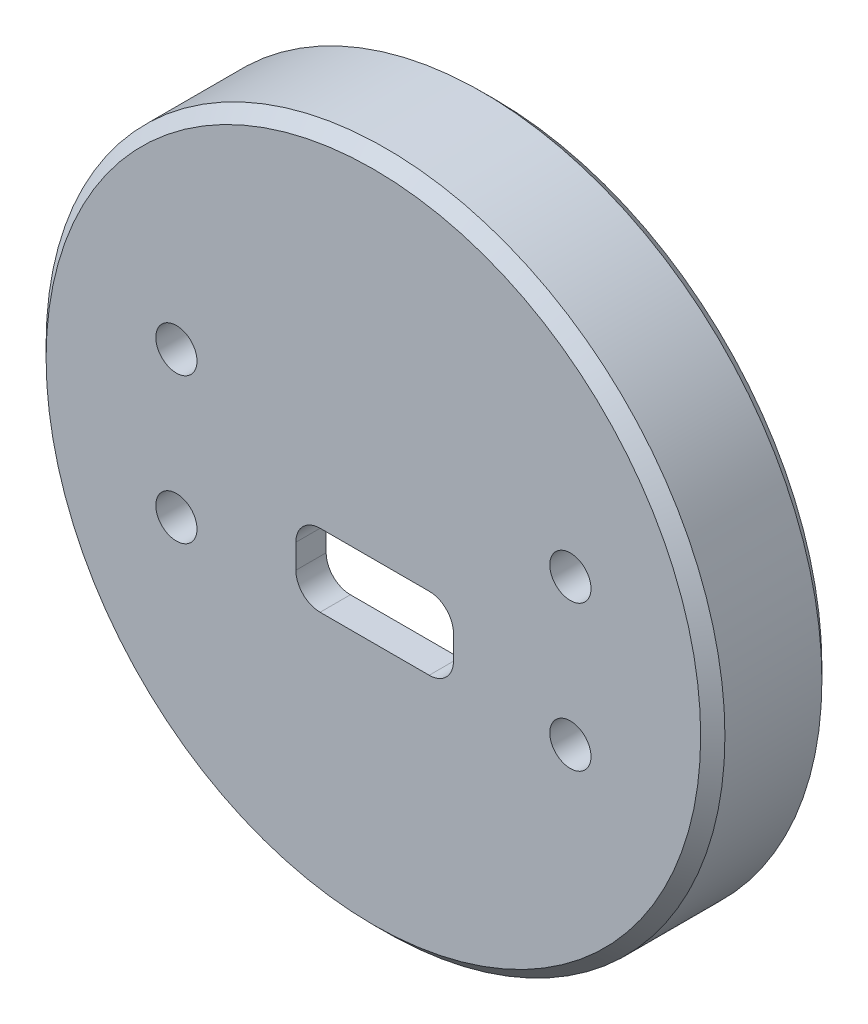
ISO-10303-21;
HEADER;
FILE_DESCRIPTION(('STEP AP214'),'2;1');
FILE_NAME('part.step','',(''),(''),'','','');
FILE_SCHEMA(('AUTOMOTIVE_DESIGN { 1 0 10303 214 1 1 1 1 }'));
ENDSEC;
DATA;
#1=APPLICATION_CONTEXT('core data for automotive mechanical design processes');
#2=APPLICATION_PROTOCOL_DEFINITION('international standard','automotive_design',2000,#1);
#3=PRODUCT_CONTEXT('',#1,'mechanical');
#4=PRODUCT('Part','Part','',(#3));
#5=PRODUCT_RELATED_PRODUCT_CATEGORY('part','',(#4));
#6=PRODUCT_DEFINITION_FORMATION('','',#4);
#7=PRODUCT_DEFINITION_CONTEXT('part definition',#1,'design');
#8=PRODUCT_DEFINITION('design','',#6,#7);
#9=PRODUCT_DEFINITION_SHAPE('','',#8);
#10=(LENGTH_UNIT() NAMED_UNIT(*) SI_UNIT(.MILLI.,.METRE.));
#11=(NAMED_UNIT(*) PLANE_ANGLE_UNIT() SI_UNIT($,.RADIAN.));
#12=(NAMED_UNIT(*) SI_UNIT($,.STERADIAN.) SOLID_ANGLE_UNIT());
#13=UNCERTAINTY_MEASURE_WITH_UNIT(LENGTH_MEASURE(1.E-05),#10,'distance_accuracy_value','');
#14=(GEOMETRIC_REPRESENTATION_CONTEXT(3) GLOBAL_UNCERTAINTY_ASSIGNED_CONTEXT((#13)) GLOBAL_UNIT_ASSIGNED_CONTEXT((#10,
#11,#12)) REPRESENTATION_CONTEXT('',''));
#15=CARTESIAN_POINT('',(0.,0.,0.));
#16=DIRECTION('',(0.,0.,1.));
#17=DIRECTION('',(1.,0.,0.));
#18=AXIS2_PLACEMENT_3D('',#15,#16,#17);
#19=CARTESIAN_POINT('',(0.,0.,7.5));
#20=DIRECTION('',(0.,0.,1.));
#21=DIRECTION('',(1.,0.,0.));
#22=AXIS2_PLACEMENT_3D('',#19,#20,#21);
#23=PLANE('',#22);
#24=CARTESIAN_POINT('',(-16.25,6.,7.5));
#25=DIRECTION('',(0.,0.,-1.));
#26=DIRECTION('',(-1.,0.,0.));
#27=AXIS2_PLACEMENT_3D('',#24,#25,#26);
#28=CIRCLE('',#27,1.69999999999999);
#29=CARTESIAN_POINT('',(-17.95,6.,7.5));
#30=VERTEX_POINT('',#29);
#31=EDGE_CURVE('E246',#30,#30,#28,.T.);
#32=ORIENTED_EDGE('',*,*,#31,.F.);
#33=EDGE_LOOP('',(#32));
#34=FACE_BOUND('',#33,.T.);
#35=CARTESIAN_POINT('',(16.25,6.,7.5));
#36=DIRECTION('',(0.,0.,-1.));
#37=DIRECTION('',(-1.,0.,0.));
#38=AXIS2_PLACEMENT_3D('',#35,#36,#37);
#39=CIRCLE('',#38,1.69999999999999);
#40=CARTESIAN_POINT('',(14.55,6.,7.5));
#41=VERTEX_POINT('',#40);
#42=EDGE_CURVE('E242',#41,#41,#39,.T.);
#43=ORIENTED_EDGE('',*,*,#42,.F.);
#44=EDGE_LOOP('',(#43));
#45=FACE_BOUND('',#44,.T.);
#46=CARTESIAN_POINT('',(0.,0.,7.50000000000001));
#47=DIRECTION('',(0.,0.,1.));
#48=DIRECTION('',(1.,0.,0.));
#49=AXIS2_PLACEMENT_3D('',#46,#47,#48);
#50=CIRCLE('',#49,25.);
#51=CARTESIAN_POINT('',(25.,0.,7.50000000000001));
#52=VERTEX_POINT('',#51);
#53=EDGE_CURVE('E146',#52,#52,#50,.F.);
#54=ORIENTED_EDGE('',*,*,#53,.T.);
#55=EDGE_LOOP('',(#54));
#56=FACE_BOUND('',#55,.T.);
#57=DIRECTION('',(1.,0.,0.));
#58=VECTOR('',#57,1.);
#59=CARTESIAN_POINT('',(6.60338017661882,-0.859999999999782,7.5));
#60=LINE('',#59,#58);
#61=CARTESIAN_POINT('',(-4.39661982338118,-0.859999999999782,7.5));
#62=VERTEX_POINT('',#61);
#63=CARTESIAN_POINT('',(4.60338017661882,-0.859999999999782,7.5));
#64=VERTEX_POINT('',#63);
#65=EDGE_CURVE('E122',#62,#64,#60,.T.);
#66=ORIENTED_EDGE('',*,*,#65,.F.);
#67=CARTESIAN_POINT('',(-4.39661982338118,-2.85999999999978,7.5));
#68=DIRECTION('',(0.,0.,1.));
#69=DIRECTION('',(1.,0.,0.));
#70=AXIS2_PLACEMENT_3D('',#67,#68,#69);
#71=CIRCLE('',#70,2.);
#72=CARTESIAN_POINT('',(-6.39661982338118,-2.85999999999978,7.5));
#73=VERTEX_POINT('',#72);
#74=EDGE_CURVE('E106',#62,#73,#71,.T.);
#75=ORIENTED_EDGE('',*,*,#74,.T.);
#76=DIRECTION('',(0.,1.,0.));
#77=VECTOR('',#76,1.);
#78=CARTESIAN_POINT('',(-6.39661982338118,-0.859999999999782,7.5));
#79=LINE('',#78,#77);
#80=CARTESIAN_POINT('',(-6.39661982338118,-4.85999999999978,7.5));
#81=VERTEX_POINT('',#80);
#82=EDGE_CURVE('E132',#81,#73,#79,.T.);
#83=ORIENTED_EDGE('',*,*,#82,.F.);
#84=CARTESIAN_POINT('',(-4.39661982338118,-4.85999999999978,7.5));
#85=DIRECTION('',(0.,0.,1.));
#86=DIRECTION('',(1.,0.,0.));
#87=AXIS2_PLACEMENT_3D('',#84,#85,#86);
#88=CIRCLE('',#87,2.);
#89=CARTESIAN_POINT('',(-4.39661982338118,-6.85999999999978,7.5));
#90=VERTEX_POINT('',#89);
#91=EDGE_CURVE('E163',#81,#90,#88,.T.);
#92=ORIENTED_EDGE('',*,*,#91,.T.);
#93=DIRECTION('',(-1.,0.,0.));
#94=VECTOR('',#93,1.);
#95=CARTESIAN_POINT('',(6.60338017661882,-6.85999999999978,7.5));
#96=LINE('',#95,#94);
#97=CARTESIAN_POINT('',(4.60338017661882,-6.85999999999978,7.5));
#98=VERTEX_POINT('',#97);
#99=EDGE_CURVE('E134',#98,#90,#96,.T.);
#100=ORIENTED_EDGE('',*,*,#99,.F.);
#101=CARTESIAN_POINT('',(4.60338017661882,-4.85999999999978,7.5));
#102=DIRECTION('',(0.,0.,1.));
#103=DIRECTION('',(1.,0.,0.));
#104=AXIS2_PLACEMENT_3D('',#101,#102,#103);
#105=CIRCLE('',#104,2.);
#106=CARTESIAN_POINT('',(6.60338017661882,-4.85999999999978,7.5));
#107=VERTEX_POINT('',#106);
#108=EDGE_CURVE('E167',#98,#107,#105,.T.);
#109=ORIENTED_EDGE('',*,*,#108,.T.);
#110=DIRECTION('',(0.,-1.,0.));
#111=VECTOR('',#110,1.);
#112=CARTESIAN_POINT('',(6.60338017661882,-0.859999999999782,7.5));
#113=LINE('',#112,#111);
#114=CARTESIAN_POINT('',(6.60338017661882,-2.85999999999978,7.5));
#115=VERTEX_POINT('',#114);
#116=EDGE_CURVE('E131',#115,#107,#113,.T.);
#117=ORIENTED_EDGE('',*,*,#116,.F.);
#118=CARTESIAN_POINT('',(4.60338017661882,-2.85999999999978,7.5));
#119=DIRECTION('',(0.,0.,1.));
#120=DIRECTION('',(1.,0.,0.));
#121=AXIS2_PLACEMENT_3D('',#118,#119,#120);
#122=CIRCLE('',#121,2.);
#123=EDGE_CURVE('E130',#115,#64,#122,.T.);
#124=ORIENTED_EDGE('',*,*,#123,.T.);
#125=EDGE_LOOP('',(#66,#75,#83,#92,#100,#109,#117,#124));
#126=FACE_BOUND('',#125,.T.);
#127=CARTESIAN_POINT('',(16.25,-6.,7.5));
#128=DIRECTION('',(0.,0.,-1.));
#129=DIRECTION('',(-1.,0.,0.));
#130=AXIS2_PLACEMENT_3D('',#127,#128,#129);
#131=CIRCLE('',#130,1.69999999999999);
#132=CARTESIAN_POINT('',(14.55,-6.,7.5));
#133=VERTEX_POINT('',#132);
#134=EDGE_CURVE('E238',#133,#133,#131,.T.);
#135=ORIENTED_EDGE('',*,*,#134,.F.);
#136=EDGE_LOOP('',(#135));
#137=FACE_BOUND('',#136,.T.);
#138=CARTESIAN_POINT('',(-16.25,-6.,7.5));
#139=DIRECTION('',(0.,0.,-1.));
#140=DIRECTION('',(-1.,0.,0.));
#141=AXIS2_PLACEMENT_3D('',#138,#139,#140);
#142=CIRCLE('',#141,1.69999999999999);
#143=CARTESIAN_POINT('',(-17.95,-6.,7.5));
#144=VERTEX_POINT('',#143);
#145=EDGE_CURVE('E250',#144,#144,#142,.T.);
#146=ORIENTED_EDGE('',*,*,#145,.F.);
#147=EDGE_LOOP('',(#146));
#148=FACE_BOUND('',#147,.T.);
#149=ADVANCED_FACE('F39',(#34,#45,#56,#126,#137,#148),#23,.F.);
#150=CARTESIAN_POINT('',(0.,0.,10.));
#151=DIRECTION('',(0.,0.,-1.));
#152=DIRECTION('',(-1.,0.,0.));
#153=AXIS2_PLACEMENT_3D('',#150,#151,#152);
#154=CYLINDRICAL_SURFACE('',#153,28.);
#155=CARTESIAN_POINT('',(0.,0.,9.00000000000001));
#156=DIRECTION('',(0.,0.,1.));
#157=DIRECTION('',(1.,0.,0.));
#158=AXIS2_PLACEMENT_3D('',#155,#156,#157);
#159=CIRCLE('',#158,28.);
#160=CARTESIAN_POINT('',(28.,0.,9.00000000000001));
#161=VERTEX_POINT('',#160);
#162=EDGE_CURVE('E47',#161,#161,#159,.F.);
#163=ORIENTED_EDGE('',*,*,#162,.T.);
#164=EDGE_LOOP('',(#163));
#165=FACE_BOUND('',#164,.T.);
#166=CARTESIAN_POINT('',(0.,0.,0.999999999999997));
#167=DIRECTION('',(0.,0.,1.));
#168=DIRECTION('',(1.,0.,0.));
#169=AXIS2_PLACEMENT_3D('',#166,#167,#168);
#170=CIRCLE('',#169,28.);
#171=CARTESIAN_POINT('',(28.,0.,0.999999999999997));
#172=VERTEX_POINT('',#171);
#173=EDGE_CURVE('E176',#172,#172,#170,.T.);
#174=ORIENTED_EDGE('',*,*,#173,.T.);
#175=EDGE_LOOP('',(#174));
#176=FACE_BOUND('',#175,.T.);
#177=ADVANCED_FACE('F181',(#165,#176),#154,.T.);
#178=CARTESIAN_POINT('',(0.,0.,10.));
#179=DIRECTION('',(0.,0.,1.));
#180=DIRECTION('',(1.,0.,0.));
#181=AXIS2_PLACEMENT_3D('',#178,#179,#180);
#182=PLANE('',#181);
#183=CARTESIAN_POINT('',(0.,0.,10.));
#184=DIRECTION('',(0.,0.,1.));
#185=DIRECTION('',(1.,0.,0.));
#186=AXIS2_PLACEMENT_3D('',#183,#184,#185);
#187=CIRCLE('',#186,27.);
#188=CARTESIAN_POINT('',(27.,0.,10.));
#189=VERTEX_POINT('',#188);
#190=EDGE_CURVE('E173',#189,#189,#187,.T.);
#191=ORIENTED_EDGE('',*,*,#190,.T.);
#192=EDGE_LOOP('',(#191));
#193=FACE_BOUND('',#192,.T.);
#194=CARTESIAN_POINT('',(-16.25,-6.,10.));
#195=DIRECTION('',(0.,0.,1.));
#196=DIRECTION('',(1.,0.,0.));
#197=AXIS2_PLACEMENT_3D('',#194,#195,#196);
#198=CIRCLE('',#197,1.69999999999999);
#199=CARTESIAN_POINT('',(-14.55,-6.,10.));
#200=VERTEX_POINT('',#199);
#201=EDGE_CURVE('E198',#200,#200,#198,.T.);
#202=ORIENTED_EDGE('',*,*,#201,.F.);
#203=EDGE_LOOP('',(#202));
#204=FACE_BOUND('',#203,.T.);
#205=CARTESIAN_POINT('',(-16.25,6.,10.));
#206=DIRECTION('',(0.,0.,1.));
#207=DIRECTION('',(1.,0.,0.));
#208=AXIS2_PLACEMENT_3D('',#205,#206,#207);
#209=CIRCLE('',#208,1.69999999999999);
#210=CARTESIAN_POINT('',(-14.55,6.,10.));
#211=VERTEX_POINT('',#210);
#212=EDGE_CURVE('E202',#211,#211,#209,.T.);
#213=ORIENTED_EDGE('',*,*,#212,.F.);
#214=EDGE_LOOP('',(#213));
#215=FACE_BOUND('',#214,.T.);
#216=CARTESIAN_POINT('',(16.25,6.,10.));
#217=DIRECTION('',(0.,0.,1.));
#218=DIRECTION('',(1.,0.,0.));
#219=AXIS2_PLACEMENT_3D('',#216,#217,#218);
#220=CIRCLE('',#219,1.69999999999999);
#221=CARTESIAN_POINT('',(17.95,6.,10.));
#222=VERTEX_POINT('',#221);
#223=EDGE_CURVE('E206',#222,#222,#220,.T.);
#224=ORIENTED_EDGE('',*,*,#223,.F.);
#225=EDGE_LOOP('',(#224));
#226=FACE_BOUND('',#225,.T.);
#227=CARTESIAN_POINT('',(16.25,-6.,10.));
#228=DIRECTION('',(0.,0.,1.));
#229=DIRECTION('',(1.,0.,0.));
#230=AXIS2_PLACEMENT_3D('',#227,#228,#229);
#231=CIRCLE('',#230,1.69999999999999);
#232=CARTESIAN_POINT('',(17.95,-6.,10.));
#233=VERTEX_POINT('',#232);
#234=EDGE_CURVE('E209',#233,#233,#231,.T.);
#235=ORIENTED_EDGE('',*,*,#234,.F.);
#236=EDGE_LOOP('',(#235));
#237=FACE_BOUND('',#236,.T.);
#238=DIRECTION('',(-1.,0.,0.));
#239=VECTOR('',#238,1.);
#240=CARTESIAN_POINT('',(6.60338017661882,-6.85999999999978,10.));
#241=LINE('',#240,#239);
#242=CARTESIAN_POINT('',(4.60338017661882,-6.85999999999978,10.));
#243=VERTEX_POINT('',#242);
#244=CARTESIAN_POINT('',(-4.39661982338118,-6.85999999999978,10.));
#245=VERTEX_POINT('',#244);
#246=EDGE_CURVE('E212',#243,#245,#241,.T.);
#247=ORIENTED_EDGE('',*,*,#246,.T.);
#248=CARTESIAN_POINT('',(-4.39661982338118,-4.85999999999978,10.));
#249=DIRECTION('',(0.,0.,1.));
#250=DIRECTION('',(1.,0.,0.));
#251=AXIS2_PLACEMENT_3D('',#248,#249,#250);
#252=CIRCLE('',#251,2.);
#253=CARTESIAN_POINT('',(-6.39661982338118,-4.85999999999978,10.));
#254=VERTEX_POINT('',#253);
#255=EDGE_CURVE('E165',#245,#254,#252,.F.);
#256=ORIENTED_EDGE('',*,*,#255,.T.);
#257=DIRECTION('',(0.,1.,0.));
#258=VECTOR('',#257,1.);
#259=CARTESIAN_POINT('',(-6.39661982338118,-0.859999999999782,10.));
#260=LINE('',#259,#258);
#261=CARTESIAN_POINT('',(-6.39661982338118,-2.85999999999978,10.));
#262=VERTEX_POINT('',#261);
#263=EDGE_CURVE('E136',#254,#262,#260,.T.);
#264=ORIENTED_EDGE('',*,*,#263,.T.);
#265=CARTESIAN_POINT('',(-4.39661982338118,-2.85999999999978,10.));
#266=DIRECTION('',(0.,0.,1.));
#267=DIRECTION('',(1.,0.,0.));
#268=AXIS2_PLACEMENT_3D('',#265,#266,#267);
#269=CIRCLE('',#268,2.);
#270=CARTESIAN_POINT('',(-4.39661982338118,-0.859999999999782,10.));
#271=VERTEX_POINT('',#270);
#272=EDGE_CURVE('E116',#262,#271,#269,.F.);
#273=ORIENTED_EDGE('',*,*,#272,.T.);
#274=DIRECTION('',(1.,0.,0.));
#275=VECTOR('',#274,1.);
#276=CARTESIAN_POINT('',(6.60338017661882,-0.859999999999782,10.));
#277=LINE('',#276,#275);
#278=CARTESIAN_POINT('',(4.60338017661882,-0.859999999999782,10.));
#279=VERTEX_POINT('',#278);
#280=EDGE_CURVE('E124',#271,#279,#277,.T.);
#281=ORIENTED_EDGE('',*,*,#280,.T.);
#282=CARTESIAN_POINT('',(4.60338017661882,-2.85999999999978,10.));
#283=DIRECTION('',(0.,0.,1.));
#284=DIRECTION('',(1.,0.,0.));
#285=AXIS2_PLACEMENT_3D('',#282,#283,#284);
#286=CIRCLE('',#285,2.);
#287=CARTESIAN_POINT('',(6.60338017661882,-2.85999999999978,10.));
#288=VERTEX_POINT('',#287);
#289=EDGE_CURVE('E61',#279,#288,#286,.F.);
#290=ORIENTED_EDGE('',*,*,#289,.T.);
#291=DIRECTION('',(0.,-1.,0.));
#292=VECTOR('',#291,1.);
#293=CARTESIAN_POINT('',(6.60338017661882,-0.859999999999782,10.));
#294=LINE('',#293,#292);
#295=CARTESIAN_POINT('',(6.60338017661882,-4.85999999999978,10.));
#296=VERTEX_POINT('',#295);
#297=EDGE_CURVE('E219',#288,#296,#294,.T.);
#298=ORIENTED_EDGE('',*,*,#297,.T.);
#299=CARTESIAN_POINT('',(4.60338017661882,-4.85999999999978,10.));
#300=DIRECTION('',(0.,0.,1.));
#301=DIRECTION('',(1.,0.,0.));
#302=AXIS2_PLACEMENT_3D('',#299,#300,#301);
#303=CIRCLE('',#302,2.);
#304=EDGE_CURVE('E169',#296,#243,#303,.F.);
#305=ORIENTED_EDGE('',*,*,#304,.T.);
#306=EDGE_LOOP('',(#247,#256,#264,#273,#281,#290,#298,#305));
#307=FACE_BOUND('',#306,.T.);
#308=ADVANCED_FACE('F190',(#193,#204,#215,#226,#237,#307),#182,.T.);
#309=CARTESIAN_POINT('',(0.,0.,0.));
#310=DIRECTION('',(0.,0.,1.));
#311=DIRECTION('',(1.,0.,0.));
#312=AXIS2_PLACEMENT_3D('',#309,#310,#311);
#313=PLANE('',#312);
#314=CARTESIAN_POINT('',(0.,0.,0.));
#315=DIRECTION('',(0.,0.,1.));
#316=DIRECTION('',(1.,0.,0.));
#317=AXIS2_PLACEMENT_3D('',#314,#315,#316);
#318=CIRCLE('',#317,27.);
#319=CARTESIAN_POINT('',(27.,0.,0.));
#320=VERTEX_POINT('',#319);
#321=EDGE_CURVE('E12',#320,#320,#318,.F.);
#322=ORIENTED_EDGE('',*,*,#321,.T.);
#323=EDGE_LOOP('',(#322));
#324=FACE_BOUND('',#323,.T.);
#325=CARTESIAN_POINT('',(0.,0.,0.));
#326=DIRECTION('',(0.,0.,-1.));
#327=DIRECTION('',(-1.,0.,0.));
#328=AXIS2_PLACEMENT_3D('',#325,#326,#327);
#329=CIRCLE('',#328,25.);
#330=CARTESIAN_POINT('',(-25.,0.,0.));
#331=VERTEX_POINT('',#330);
#332=EDGE_CURVE('E143',#331,#331,#329,.T.);
#333=ORIENTED_EDGE('',*,*,#332,.F.);
#334=EDGE_LOOP('',(#333));
#335=FACE_BOUND('',#334,.T.);
#336=ADVANCED_FACE('F193',(#324,#335),#313,.F.);
#337=CARTESIAN_POINT('',(0.,0.,80.7106781186548));
#338=DIRECTION('',(0.,0.,-1.));
#339=DIRECTION('',(-1.,0.,0.));
#340=AXIS2_PLACEMENT_3D('',#337,#338,#339);
#341=CYLINDRICAL_SURFACE('',#340,25.);
#342=ORIENTED_EDGE('',*,*,#332,.T.);
#343=EDGE_LOOP('',(#342));
#344=FACE_BOUND('',#343,.T.);
#345=ORIENTED_EDGE('',*,*,#53,.F.);
#346=EDGE_LOOP('',(#345));
#347=FACE_BOUND('',#346,.T.);
#348=ADVANCED_FACE('F266',(#344,#347),#341,.F.);
#349=CARTESIAN_POINT('',(-6.39661982338118,-0.859999999999782,10.001));
#350=DIRECTION('',(-1.,0.,0.));
#351=DIRECTION('',(0.,-1.,0.));
#352=AXIS2_PLACEMENT_3D('',#349,#350,#351);
#353=PLANE('',#352);
#354=ORIENTED_EDGE('',*,*,#82,.T.);
#355=DIRECTION('',(0.,0.,-1.));
#356=VECTOR('',#355,1.);
#357=CARTESIAN_POINT('',(-6.39661982338118,-2.85999999999978,10.));
#358=LINE('',#357,#356);
#359=EDGE_CURVE('E111',#73,#262,#358,.F.);
#360=ORIENTED_EDGE('',*,*,#359,.T.);
#361=ORIENTED_EDGE('',*,*,#263,.F.);
#362=DIRECTION('',(0.,0.,-1.));
#363=VECTOR('',#362,1.);
#364=CARTESIAN_POINT('',(-6.39661982338118,-4.85999999999978,7.5));
#365=LINE('',#364,#363);
#366=EDGE_CURVE('E125',#254,#81,#365,.T.);
#367=ORIENTED_EDGE('',*,*,#366,.T.);
#368=EDGE_LOOP('',(#354,#360,#361,#367));
#369=FACE_BOUND('',#368,.T.);
#370=ADVANCED_FACE('F226',(#369),#353,.F.);
#371=CARTESIAN_POINT('',(6.60338017661882,-6.85999999999978,10.001));
#372=DIRECTION('',(0.,-1.,0.));
#373=DIRECTION('',(0.,0.,-1.));
#374=AXIS2_PLACEMENT_3D('',#371,#372,#373);
#375=PLANE('',#374);
#376=ORIENTED_EDGE('',*,*,#99,.T.);
#377=DIRECTION('',(0.,0.,-1.));
#378=VECTOR('',#377,1.);
#379=CARTESIAN_POINT('',(-4.39661982338118,-6.85999999999978,10.));
#380=LINE('',#379,#378);
#381=EDGE_CURVE('E156',#90,#245,#380,.F.);
#382=ORIENTED_EDGE('',*,*,#381,.T.);
#383=ORIENTED_EDGE('',*,*,#246,.F.);
#384=DIRECTION('',(0.,0.,-1.));
#385=VECTOR('',#384,1.);
#386=CARTESIAN_POINT('',(4.60338017661882,-6.85999999999978,7.5));
#387=LINE('',#386,#385);
#388=EDGE_CURVE('E153',#243,#98,#387,.T.);
#389=ORIENTED_EDGE('',*,*,#388,.T.);
#390=EDGE_LOOP('',(#376,#382,#383,#389));
#391=FACE_BOUND('',#390,.T.);
#392=ADVANCED_FACE('F228',(#391),#375,.F.);
#393=CARTESIAN_POINT('',(6.60338017661882,-0.859999999999782,10.001));
#394=DIRECTION('',(1.,0.,0.));
#395=DIRECTION('',(0.,1.,0.));
#396=AXIS2_PLACEMENT_3D('',#393,#394,#395);
#397=PLANE('',#396);
#398=ORIENTED_EDGE('',*,*,#116,.T.);
#399=DIRECTION('',(0.,0.,-1.));
#400=VECTOR('',#399,1.);
#401=CARTESIAN_POINT('',(6.60338017661882,-4.85999999999978,10.));
#402=LINE('',#401,#400);
#403=EDGE_CURVE('E54',#107,#296,#402,.F.);
#404=ORIENTED_EDGE('',*,*,#403,.T.);
#405=ORIENTED_EDGE('',*,*,#297,.F.);
#406=DIRECTION('',(0.,0.,-1.));
#407=VECTOR('',#406,1.);
#408=CARTESIAN_POINT('',(6.60338017661882,-2.85999999999978,7.5));
#409=LINE('',#408,#407);
#410=EDGE_CURVE('E158',#288,#115,#409,.T.);
#411=ORIENTED_EDGE('',*,*,#410,.T.);
#412=EDGE_LOOP('',(#398,#404,#405,#411));
#413=FACE_BOUND('',#412,.T.);
#414=ADVANCED_FACE('F231',(#413),#397,.F.);
#415=CARTESIAN_POINT('',(6.60338017661882,-0.859999999999782,10.001));
#416=DIRECTION('',(0.,1.,0.));
#417=DIRECTION('',(0.,0.,1.));
#418=AXIS2_PLACEMENT_3D('',#415,#416,#417);
#419=PLANE('',#418);
#420=ORIENTED_EDGE('',*,*,#280,.F.);
#421=DIRECTION('',(0.,0.,-1.));
#422=VECTOR('',#421,1.);
#423=CARTESIAN_POINT('',(-4.39661982338118,-0.859999999999782,7.5));
#424=LINE('',#423,#422);
#425=EDGE_CURVE('E110',#271,#62,#424,.T.);
#426=ORIENTED_EDGE('',*,*,#425,.T.);
#427=ORIENTED_EDGE('',*,*,#65,.T.);
#428=DIRECTION('',(0.,0.,-1.));
#429=VECTOR('',#428,1.);
#430=CARTESIAN_POINT('',(4.60338017661882,-0.859999999999782,10.));
#431=LINE('',#430,#429);
#432=EDGE_CURVE('E126',#64,#279,#431,.F.);
#433=ORIENTED_EDGE('',*,*,#432,.T.);
#434=EDGE_LOOP('',(#420,#426,#427,#433));
#435=FACE_BOUND('',#434,.T.);
#436=ADVANCED_FACE('F121',(#435),#419,.F.);
#437=CARTESIAN_POINT('',(-4.39661982338118,-2.85999999999978,10.001));
#438=DIRECTION('',(0.,0.,1.));
#439=DIRECTION('',(1.,0.,0.));
#440=AXIS2_PLACEMENT_3D('',#437,#438,#439);
#441=CYLINDRICAL_SURFACE('',#440,2.);
#442=ORIENTED_EDGE('',*,*,#272,.F.);
#443=ORIENTED_EDGE('',*,*,#359,.F.);
#444=ORIENTED_EDGE('',*,*,#74,.F.);
#445=ORIENTED_EDGE('',*,*,#425,.F.);
#446=EDGE_LOOP('',(#442,#443,#444,#445));
#447=FACE_BOUND('',#446,.T.);
#448=ADVANCED_FACE('F109',(#447),#441,.F.);
#449=CARTESIAN_POINT('',(-4.39661982338118,-4.85999999999978,10.001));
#450=DIRECTION('',(0.,0.,1.));
#451=DIRECTION('',(1.,0.,0.));
#452=AXIS2_PLACEMENT_3D('',#449,#450,#451);
#453=CYLINDRICAL_SURFACE('',#452,2.);
#454=ORIENTED_EDGE('',*,*,#255,.F.);
#455=ORIENTED_EDGE('',*,*,#381,.F.);
#456=ORIENTED_EDGE('',*,*,#91,.F.);
#457=ORIENTED_EDGE('',*,*,#366,.F.);
#458=EDGE_LOOP('',(#454,#455,#456,#457));
#459=FACE_BOUND('',#458,.T.);
#460=ADVANCED_FACE('F224',(#459),#453,.F.);
#461=CARTESIAN_POINT('',(4.60338017661882,-4.85999999999978,10.001));
#462=DIRECTION('',(0.,0.,1.));
#463=DIRECTION('',(1.,0.,0.));
#464=AXIS2_PLACEMENT_3D('',#461,#462,#463);
#465=CYLINDRICAL_SURFACE('',#464,2.);
#466=ORIENTED_EDGE('',*,*,#304,.F.);
#467=ORIENTED_EDGE('',*,*,#403,.F.);
#468=ORIENTED_EDGE('',*,*,#108,.F.);
#469=ORIENTED_EDGE('',*,*,#388,.F.);
#470=EDGE_LOOP('',(#466,#467,#468,#469));
#471=FACE_BOUND('',#470,.T.);
#472=ADVANCED_FACE('F230',(#471),#465,.F.);
#473=CARTESIAN_POINT('',(4.60338017661882,-2.85999999999978,10.001));
#474=DIRECTION('',(0.,0.,1.));
#475=DIRECTION('',(1.,0.,0.));
#476=AXIS2_PLACEMENT_3D('',#473,#474,#475);
#477=CYLINDRICAL_SURFACE('',#476,2.);
#478=ORIENTED_EDGE('',*,*,#289,.F.);
#479=ORIENTED_EDGE('',*,*,#432,.F.);
#480=ORIENTED_EDGE('',*,*,#123,.F.);
#481=ORIENTED_EDGE('',*,*,#410,.F.);
#482=EDGE_LOOP('',(#478,#479,#480,#481));
#483=FACE_BOUND('',#482,.T.);
#484=ADVANCED_FACE('F234',(#483),#477,.F.);
#485=CARTESIAN_POINT('',(16.25,-6.,7.5));
#486=DIRECTION('',(0.,0.,-1.));
#487=DIRECTION('',(-1.,0.,0.));
#488=AXIS2_PLACEMENT_3D('',#485,#486,#487);
#489=CYLINDRICAL_SURFACE('',#488,1.69999999999999);
#490=ORIENTED_EDGE('',*,*,#134,.T.);
#491=EDGE_LOOP('',(#490));
#492=FACE_BOUND('',#491,.T.);
#493=ORIENTED_EDGE('',*,*,#234,.T.);
#494=EDGE_LOOP('',(#493));
#495=FACE_BOUND('',#494,.T.);
#496=ADVANCED_FACE('F279',(#492,#495),#489,.F.);
#497=CARTESIAN_POINT('',(16.25,6.,7.5));
#498=DIRECTION('',(0.,0.,-1.));
#499=DIRECTION('',(-1.,0.,0.));
#500=AXIS2_PLACEMENT_3D('',#497,#498,#499);
#501=CYLINDRICAL_SURFACE('',#500,1.69999999999999);
#502=ORIENTED_EDGE('',*,*,#42,.T.);
#503=EDGE_LOOP('',(#502));
#504=FACE_BOUND('',#503,.T.);
#505=ORIENTED_EDGE('',*,*,#223,.T.);
#506=EDGE_LOOP('',(#505));
#507=FACE_BOUND('',#506,.T.);
#508=ADVANCED_FACE('F283',(#504,#507),#501,.F.);
#509=CARTESIAN_POINT('',(-16.25,6.,7.5));
#510=DIRECTION('',(0.,0.,-1.));
#511=DIRECTION('',(-1.,0.,0.));
#512=AXIS2_PLACEMENT_3D('',#509,#510,#511);
#513=CYLINDRICAL_SURFACE('',#512,1.69999999999999);
#514=ORIENTED_EDGE('',*,*,#31,.T.);
#515=EDGE_LOOP('',(#514));
#516=FACE_BOUND('',#515,.T.);
#517=ORIENTED_EDGE('',*,*,#212,.T.);
#518=EDGE_LOOP('',(#517));
#519=FACE_BOUND('',#518,.T.);
#520=ADVANCED_FACE('F289',(#516,#519),#513,.F.);
#521=CARTESIAN_POINT('',(-16.25,-6.,7.5));
#522=DIRECTION('',(0.,0.,-1.));
#523=DIRECTION('',(-1.,0.,0.));
#524=AXIS2_PLACEMENT_3D('',#521,#522,#523);
#525=CYLINDRICAL_SURFACE('',#524,1.69999999999999);
#526=ORIENTED_EDGE('',*,*,#145,.T.);
#527=EDGE_LOOP('',(#526));
#528=FACE_BOUND('',#527,.T.);
#529=ORIENTED_EDGE('',*,*,#201,.T.);
#530=EDGE_LOOP('',(#529));
#531=FACE_BOUND('',#530,.T.);
#532=ADVANCED_FACE('F187',(#528,#531),#525,.F.);
#533=CARTESIAN_POINT('',(0.,0.,10.));
#534=DIRECTION('',(0.,0.,-1.));
#535=DIRECTION('',(-1.,0.,0.));
#536=AXIS2_PLACEMENT_3D('',#533,#534,#535);
#537=CONICAL_SURFACE('',#536,27.,0.785398163397448);
#538=ORIENTED_EDGE('',*,*,#162,.F.);
#539=EDGE_LOOP('',(#538));
#540=FACE_BOUND('',#539,.T.);
#541=ORIENTED_EDGE('',*,*,#190,.F.);
#542=EDGE_LOOP('',(#541));
#543=FACE_BOUND('',#542,.T.);
#544=ADVANCED_FACE('F184',(#540,#543),#537,.T.);
#545=CARTESIAN_POINT('',(0.,0.,0.999999999999997));
#546=DIRECTION('',(0.,0.,1.));
#547=DIRECTION('',(1.,0.,0.));
#548=AXIS2_PLACEMENT_3D('',#545,#546,#547);
#549=CONICAL_SURFACE('',#548,28.,0.78539816339745);
#550=ORIENTED_EDGE('',*,*,#321,.F.);
#551=EDGE_LOOP('',(#550));
#552=FACE_BOUND('',#551,.T.);
#553=ORIENTED_EDGE('',*,*,#173,.F.);
#554=EDGE_LOOP('',(#553));
#555=FACE_BOUND('',#554,.T.);
#556=ADVANCED_FACE('F41',(#552,#555),#549,.T.);
#557=CLOSED_SHELL('',(#149,#177,#308,#336,#348,#370,#392,#414,#436,#448,#460,#472,#484,#496,
#508,#520,#532,#544,#556));
#558=MANIFOLD_SOLID_BREP('B2',#557);
#559=ADVANCED_BREP_SHAPE_REPRESENTATION('',(#18,#558),#14);
#560=SHAPE_DEFINITION_REPRESENTATION(#9,#559);
ENDSEC;
END-ISO-10303-21;
